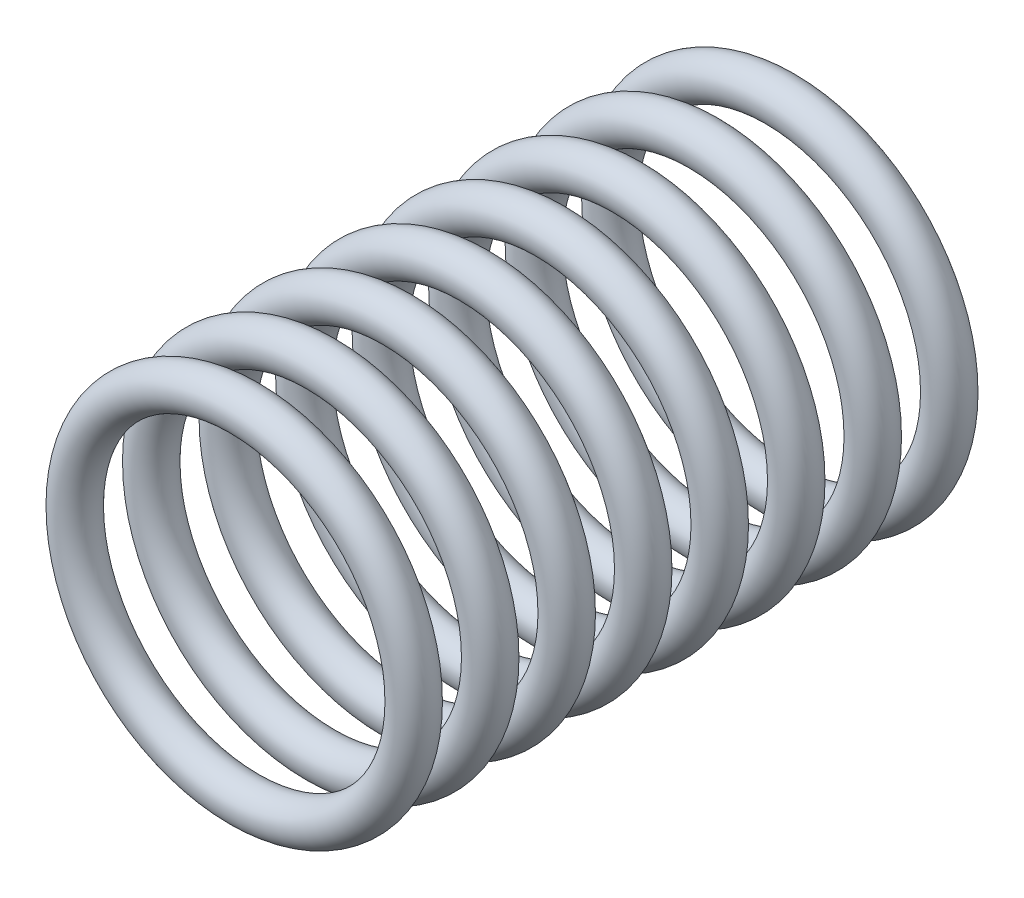
ISO-10303-21;
HEADER;
FILE_DESCRIPTION(('STEP AP214'),'2;1');
FILE_NAME('part.step','',(''),(''),'','','');
FILE_SCHEMA(('AUTOMOTIVE_DESIGN { 1 0 10303 214 1 1 1 1 }'));
ENDSEC;
DATA;
#1=APPLICATION_CONTEXT('core data for automotive mechanical design processes');
#2=APPLICATION_PROTOCOL_DEFINITION('international standard','automotive_design',2000,#1);
#3=PRODUCT_CONTEXT('',#1,'mechanical');
#4=PRODUCT('Part','Part','',(#3));
#5=PRODUCT_RELATED_PRODUCT_CATEGORY('part','',(#4));
#6=PRODUCT_DEFINITION_FORMATION('','',#4);
#7=PRODUCT_DEFINITION_CONTEXT('part definition',#1,'design');
#8=PRODUCT_DEFINITION('design','',#6,#7);
#9=PRODUCT_DEFINITION_SHAPE('','',#8);
#10=(LENGTH_UNIT() NAMED_UNIT(*) SI_UNIT(.MILLI.,.METRE.));
#11=(NAMED_UNIT(*) PLANE_ANGLE_UNIT() SI_UNIT($,.RADIAN.));
#12=(NAMED_UNIT(*) SI_UNIT($,.STERADIAN.) SOLID_ANGLE_UNIT());
#13=UNCERTAINTY_MEASURE_WITH_UNIT(LENGTH_MEASURE(1.E-05),#10,'distance_accuracy_value','');
#14=(GEOMETRIC_REPRESENTATION_CONTEXT(3) GLOBAL_UNCERTAINTY_ASSIGNED_CONTEXT((#13)) GLOBAL_UNIT_ASSIGNED_CONTEXT((#10,
#11,#12)) REPRESENTATION_CONTEXT('',''));
#15=CARTESIAN_POINT('',(0.,0.,0.));
#16=DIRECTION('',(0.,0.,1.));
#17=DIRECTION('',(1.,0.,0.));
#18=AXIS2_PLACEMENT_3D('',#15,#16,#17);
#19=CARTESIAN_POINT('',(0.,0.,16.4));
#20=DIRECTION('',(0.,0.,-1.));
#21=DIRECTION('',(-1.,0.,0.));
#22=AXIS2_PLACEMENT_3D('',#19,#20,#21);
#23=TOROIDAL_SURFACE('',#22,5.,0.6);
#24=CARTESIAN_POINT('',(-5.6,0.,16.4));
#25=VERTEX_POINT('',#24);
#26=VERTEX_LOOP('',#25);
#27=FACE_BOUND('',#26,.T.);
#28=ADVANCED_FACE('F44',(#27),#23,.T.);
#29=CLOSED_SHELL('',(#28));
#30=MANIFOLD_SOLID_BREP('B2',#29);
#31=CARTESIAN_POINT('',(0.,0.,14.1429));
#32=DIRECTION('',(0.,0.,-1.));
#33=DIRECTION('',(-1.,0.,0.));
#34=AXIS2_PLACEMENT_3D('',#31,#32,#33);
#35=TOROIDAL_SURFACE('',#34,5.,0.6);
#36=CARTESIAN_POINT('',(-5.6,0.,14.1429));
#37=VERTEX_POINT('',#36);
#38=VERTEX_LOOP('',#37);
#39=FACE_BOUND('',#38,.T.);
#40=ADVANCED_FACE('F63',(#39),#35,.T.);
#41=CLOSED_SHELL('',(#40));
#42=MANIFOLD_SOLID_BREP('B6',#41);
#43=CARTESIAN_POINT('',(0.,0.,11.8857));
#44=DIRECTION('',(0.,0.,-1.));
#45=DIRECTION('',(-1.,0.,0.));
#46=AXIS2_PLACEMENT_3D('',#43,#44,#45);
#47=TOROIDAL_SURFACE('',#46,5.,0.6);
#48=CARTESIAN_POINT('',(-5.6,0.,11.8857));
#49=VERTEX_POINT('',#48);
#50=VERTEX_LOOP('',#49);
#51=FACE_BOUND('',#50,.T.);
#52=ADVANCED_FACE('F82',(#51),#47,.T.);
#53=CLOSED_SHELL('',(#52));
#54=MANIFOLD_SOLID_BREP('B40',#53);
#55=CARTESIAN_POINT('',(0.,0.,9.6286));
#56=DIRECTION('',(0.,0.,-1.));
#57=DIRECTION('',(-1.,0.,0.));
#58=AXIS2_PLACEMENT_3D('',#55,#56,#57);
#59=TOROIDAL_SURFACE('',#58,5.,0.6);
#60=CARTESIAN_POINT('',(-5.6,0.,9.6286));
#61=VERTEX_POINT('',#60);
#62=VERTEX_LOOP('',#61);
#63=FACE_BOUND('',#62,.T.);
#64=ADVANCED_FACE('F101',(#63),#59,.T.);
#65=CLOSED_SHELL('',(#64));
#66=MANIFOLD_SOLID_BREP('B59',#65);
#67=CARTESIAN_POINT('',(0.,0.,7.3714));
#68=DIRECTION('',(0.,0.,-1.));
#69=DIRECTION('',(-1.,0.,0.));
#70=AXIS2_PLACEMENT_3D('',#67,#68,#69);
#71=TOROIDAL_SURFACE('',#70,5.,0.6);
#72=CARTESIAN_POINT('',(-5.6,0.,7.3714));
#73=VERTEX_POINT('',#72);
#74=VERTEX_LOOP('',#73);
#75=FACE_BOUND('',#74,.T.);
#76=ADVANCED_FACE('F120',(#75),#71,.T.);
#77=CLOSED_SHELL('',(#76));
#78=MANIFOLD_SOLID_BREP('B78',#77);
#79=CARTESIAN_POINT('',(0.,0.,5.1143));
#80=DIRECTION('',(0.,0.,-1.));
#81=DIRECTION('',(-1.,0.,0.));
#82=AXIS2_PLACEMENT_3D('',#79,#80,#81);
#83=TOROIDAL_SURFACE('',#82,5.,0.6);
#84=CARTESIAN_POINT('',(-5.6,0.,5.1143));
#85=VERTEX_POINT('',#84);
#86=VERTEX_LOOP('',#85);
#87=FACE_BOUND('',#86,.T.);
#88=ADVANCED_FACE('F139',(#87),#83,.T.);
#89=CLOSED_SHELL('',(#88));
#90=MANIFOLD_SOLID_BREP('B97',#89);
#91=CARTESIAN_POINT('',(0.,0.,2.8571));
#92=DIRECTION('',(0.,0.,-1.));
#93=DIRECTION('',(-1.,0.,0.));
#94=AXIS2_PLACEMENT_3D('',#91,#92,#93);
#95=TOROIDAL_SURFACE('',#94,5.,0.6);
#96=CARTESIAN_POINT('',(-5.6,0.,2.8571));
#97=VERTEX_POINT('',#96);
#98=VERTEX_LOOP('',#97);
#99=FACE_BOUND('',#98,.T.);
#100=ADVANCED_FACE('F157',(#99),#95,.T.);
#101=CLOSED_SHELL('',(#100));
#102=MANIFOLD_SOLID_BREP('B116',#101);
#103=CARTESIAN_POINT('',(0.,0.,0.6));
#104=DIRECTION('',(0.,0.,-1.));
#105=DIRECTION('',(-1.,0.,0.));
#106=AXIS2_PLACEMENT_3D('',#103,#104,#105);
#107=TOROIDAL_SURFACE('',#106,5.,0.6);
#108=CARTESIAN_POINT('',(-5.6,0.,0.6));
#109=VERTEX_POINT('',#108);
#110=VERTEX_LOOP('',#109);
#111=FACE_BOUND('',#110,.T.);
#112=ADVANCED_FACE('F170',(#111),#107,.T.);
#113=CLOSED_SHELL('',(#112));
#114=MANIFOLD_SOLID_BREP('B135',#113);
#115=ADVANCED_BREP_SHAPE_REPRESENTATION('',(#18,#30,#42,#54,#66,#78,#90,#102,#114),#14);
#116=SHAPE_DEFINITION_REPRESENTATION(#9,#115);
ENDSEC;
END-ISO-10303-21;
